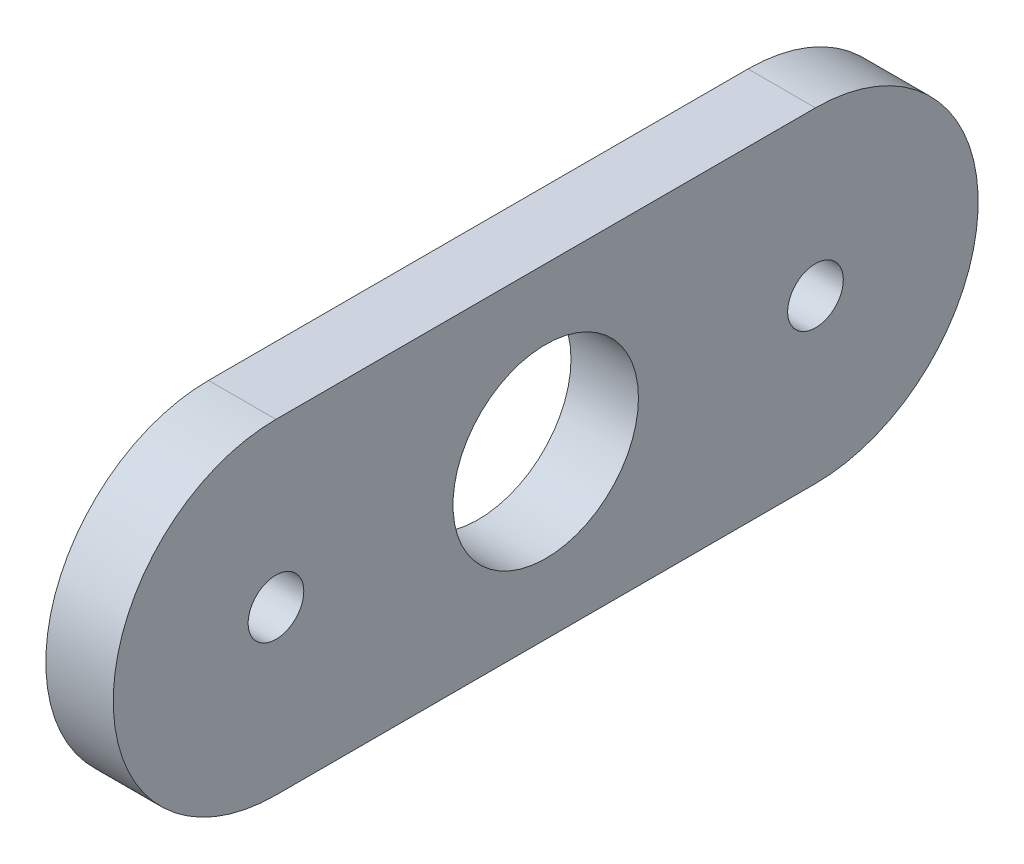
ISO-10303-21;
HEADER;
FILE_DESCRIPTION(('STEP AP214'),'2;1');
FILE_NAME('part.step','',(''),(''),'','','');
FILE_SCHEMA(('AUTOMOTIVE_DESIGN { 1 0 10303 214 1 1 1 1 }'));
ENDSEC;
DATA;
#1=APPLICATION_CONTEXT('core data for automotive mechanical design processes');
#2=APPLICATION_PROTOCOL_DEFINITION('international standard','automotive_design',2000,#1);
#3=PRODUCT_CONTEXT('',#1,'mechanical');
#4=PRODUCT('Part','Part','',(#3));
#5=PRODUCT_RELATED_PRODUCT_CATEGORY('part','',(#4));
#6=PRODUCT_DEFINITION_FORMATION('','',#4);
#7=PRODUCT_DEFINITION_CONTEXT('part definition',#1,'design');
#8=PRODUCT_DEFINITION('design','',#6,#7);
#9=PRODUCT_DEFINITION_SHAPE('','',#8);
#10=(LENGTH_UNIT() NAMED_UNIT(*) SI_UNIT(.MILLI.,.METRE.));
#11=(NAMED_UNIT(*) PLANE_ANGLE_UNIT() SI_UNIT($,.RADIAN.));
#12=(NAMED_UNIT(*) SI_UNIT($,.STERADIAN.) SOLID_ANGLE_UNIT());
#13=UNCERTAINTY_MEASURE_WITH_UNIT(LENGTH_MEASURE(1.E-05),#10,'distance_accuracy_value','');
#14=(GEOMETRIC_REPRESENTATION_CONTEXT(3) GLOBAL_UNCERTAINTY_ASSIGNED_CONTEXT((#13)) GLOBAL_UNIT_ASSIGNED_CONTEXT((#10,
#11,#12)) REPRESENTATION_CONTEXT('',''));
#15=CARTESIAN_POINT('',(0.,0.,0.));
#16=DIRECTION('',(0.,0.,1.));
#17=DIRECTION('',(1.,0.,0.));
#18=AXIS2_PLACEMENT_3D('',#15,#16,#17);
#19=CARTESIAN_POINT('',(4.,0.,16.));
#20=DIRECTION('',(1.,0.,0.));
#21=DIRECTION('',(0.,0.,-1.));
#22=AXIS2_PLACEMENT_3D('',#19,#20,#21);
#23=PLANE('',#22);
#24=CARTESIAN_POINT('',(4.,0.,-16.));
#25=DIRECTION('',(1.,0.,0.));
#26=DIRECTION('',(0.,0.,-1.));
#27=AXIS2_PLACEMENT_3D('',#24,#25,#26);
#28=CIRCLE('',#27,1.65);
#29=CARTESIAN_POINT('',(4.,0.,-17.65));
#30=VERTEX_POINT('',#29);
#31=EDGE_CURVE('E116',#30,#30,#28,.T.);
#32=ORIENTED_EDGE('',*,*,#31,.F.);
#33=EDGE_LOOP('',(#32));
#34=FACE_BOUND('',#33,.T.);
#35=CARTESIAN_POINT('',(4.,0.,16.));
#36=DIRECTION('',(1.,0.,0.));
#37=DIRECTION('',(0.,0.,-1.));
#38=AXIS2_PLACEMENT_3D('',#35,#36,#37);
#39=CIRCLE('',#38,9.65);
#40=CARTESIAN_POINT('',(4.,9.65,16.));
#41=VERTEX_POINT('',#40);
#42=CARTESIAN_POINT('',(4.,-9.65,16.));
#43=VERTEX_POINT('',#42);
#44=EDGE_CURVE('E86',#41,#43,#39,.T.);
#45=ORIENTED_EDGE('',*,*,#44,.T.);
#46=DIRECTION('',(0.,0.,-1.));
#47=VECTOR('',#46,1.);
#48=CARTESIAN_POINT('',(4.,-9.65,16.));
#49=LINE('',#48,#47);
#50=CARTESIAN_POINT('',(4.,-9.65,-16.));
#51=VERTEX_POINT('',#50);
#52=EDGE_CURVE('E81',#43,#51,#49,.T.);
#53=ORIENTED_EDGE('',*,*,#52,.T.);
#54=CARTESIAN_POINT('',(4.,0.,-16.));
#55=DIRECTION('',(1.,0.,0.));
#56=DIRECTION('',(0.,0.,-1.));
#57=AXIS2_PLACEMENT_3D('',#54,#55,#56);
#58=CIRCLE('',#57,9.65);
#59=CARTESIAN_POINT('',(4.,9.65000000000001,-16.));
#60=VERTEX_POINT('',#59);
#61=EDGE_CURVE('E84',#51,#60,#58,.T.);
#62=ORIENTED_EDGE('',*,*,#61,.T.);
#63=DIRECTION('',(0.,0.,1.));
#64=VECTOR('',#63,1.);
#65=CARTESIAN_POINT('',(4.,9.65,16.));
#66=LINE('',#65,#64);
#67=EDGE_CURVE('E51',#60,#41,#66,.T.);
#68=ORIENTED_EDGE('',*,*,#67,.T.);
#69=EDGE_LOOP('',(#45,#53,#62,#68));
#70=FACE_BOUND('',#69,.T.);
#71=CARTESIAN_POINT('',(4.,0.,16.));
#72=DIRECTION('',(1.,0.,0.));
#73=DIRECTION('',(0.,0.,-1.));
#74=AXIS2_PLACEMENT_3D('',#71,#72,#73);
#75=CIRCLE('',#74,1.65);
#76=CARTESIAN_POINT('',(4.,0.,14.35));
#77=VERTEX_POINT('',#76);
#78=EDGE_CURVE('E101',#77,#77,#75,.T.);
#79=ORIENTED_EDGE('',*,*,#78,.F.);
#80=EDGE_LOOP('',(#79));
#81=FACE_BOUND('',#80,.T.);
#82=CARTESIAN_POINT('',(4.,0.,0.));
#83=DIRECTION('',(1.,0.,0.));
#84=DIRECTION('',(0.,0.,-1.));
#85=AXIS2_PLACEMENT_3D('',#82,#83,#84);
#86=CIRCLE('',#85,5.5);
#87=CARTESIAN_POINT('',(4.,0.,-5.5));
#88=VERTEX_POINT('',#87);
#89=EDGE_CURVE('E122',#88,#88,#86,.T.);
#90=ORIENTED_EDGE('',*,*,#89,.F.);
#91=EDGE_LOOP('',(#90));
#92=FACE_BOUND('',#91,.T.);
#93=ADVANCED_FACE('F34',(#34,#70,#81,#92),#23,.T.);
#94=CARTESIAN_POINT('',(0.,0.,16.));
#95=DIRECTION('',(1.,0.,0.));
#96=DIRECTION('',(0.,0.,-1.));
#97=AXIS2_PLACEMENT_3D('',#94,#95,#96);
#98=PLANE('',#97);
#99=CARTESIAN_POINT('',(0.,0.,16.));
#100=DIRECTION('',(1.,0.,0.));
#101=DIRECTION('',(0.,0.,-1.));
#102=AXIS2_PLACEMENT_3D('',#99,#100,#101);
#103=CIRCLE('',#102,9.65);
#104=CARTESIAN_POINT('',(0.,9.65,16.));
#105=VERTEX_POINT('',#104);
#106=CARTESIAN_POINT('',(0.,-9.65,16.));
#107=VERTEX_POINT('',#106);
#108=EDGE_CURVE('E98',#105,#107,#103,.T.);
#109=ORIENTED_EDGE('',*,*,#108,.F.);
#110=DIRECTION('',(0.,0.,1.));
#111=VECTOR('',#110,1.);
#112=CARTESIAN_POINT('',(0.,9.65,16.));
#113=LINE('',#112,#111);
#114=CARTESIAN_POINT('',(0.,9.65000000000001,-16.));
#115=VERTEX_POINT('',#114);
#116=EDGE_CURVE('E74',#115,#105,#113,.T.);
#117=ORIENTED_EDGE('',*,*,#116,.F.);
#118=CARTESIAN_POINT('',(0.,0.,-16.));
#119=DIRECTION('',(1.,0.,0.));
#120=DIRECTION('',(0.,0.,-1.));
#121=AXIS2_PLACEMENT_3D('',#118,#119,#120);
#122=CIRCLE('',#121,9.65);
#123=CARTESIAN_POINT('',(0.,-9.65,-16.));
#124=VERTEX_POINT('',#123);
#125=EDGE_CURVE('E68',#124,#115,#122,.T.);
#126=ORIENTED_EDGE('',*,*,#125,.F.);
#127=DIRECTION('',(0.,0.,-1.));
#128=VECTOR('',#127,1.);
#129=CARTESIAN_POINT('',(0.,-9.65,16.));
#130=LINE('',#129,#128);
#131=EDGE_CURVE('E90',#107,#124,#130,.T.);
#132=ORIENTED_EDGE('',*,*,#131,.F.);
#133=EDGE_LOOP('',(#109,#117,#126,#132));
#134=FACE_BOUND('',#133,.T.);
#135=CARTESIAN_POINT('',(0.,0.,16.));
#136=DIRECTION('',(1.,0.,0.));
#137=DIRECTION('',(0.,0.,-1.));
#138=AXIS2_PLACEMENT_3D('',#135,#136,#137);
#139=CIRCLE('',#138,1.65);
#140=CARTESIAN_POINT('',(0.,0.,14.35));
#141=VERTEX_POINT('',#140);
#142=EDGE_CURVE('E113',#141,#141,#139,.T.);
#143=ORIENTED_EDGE('',*,*,#142,.T.);
#144=EDGE_LOOP('',(#143));
#145=FACE_BOUND('',#144,.T.);
#146=CARTESIAN_POINT('',(0.,0.,-16.));
#147=DIRECTION('',(1.,0.,0.));
#148=DIRECTION('',(0.,0.,-1.));
#149=AXIS2_PLACEMENT_3D('',#146,#147,#148);
#150=CIRCLE('',#149,1.65);
#151=CARTESIAN_POINT('',(0.,0.,-17.65));
#152=VERTEX_POINT('',#151);
#153=EDGE_CURVE('E119',#152,#152,#150,.T.);
#154=ORIENTED_EDGE('',*,*,#153,.T.);
#155=EDGE_LOOP('',(#154));
#156=FACE_BOUND('',#155,.T.);
#157=CARTESIAN_POINT('',(0.,0.,0.));
#158=DIRECTION('',(1.,0.,0.));
#159=DIRECTION('',(0.,0.,-1.));
#160=AXIS2_PLACEMENT_3D('',#157,#158,#159);
#161=CIRCLE('',#160,5.5);
#162=CARTESIAN_POINT('',(0.,0.,-5.5));
#163=VERTEX_POINT('',#162);
#164=EDGE_CURVE('E125',#163,#163,#161,.T.);
#165=ORIENTED_EDGE('',*,*,#164,.T.);
#166=EDGE_LOOP('',(#165));
#167=FACE_BOUND('',#166,.T.);
#168=ADVANCED_FACE('F109',(#134,#145,#156,#167),#98,.F.);
#169=CARTESIAN_POINT('',(4.,0.,16.));
#170=DIRECTION('',(-1.,0.,0.));
#171=DIRECTION('',(0.,0.,1.));
#172=AXIS2_PLACEMENT_3D('',#169,#170,#171);
#173=CYLINDRICAL_SURFACE('',#172,9.65);
#174=ORIENTED_EDGE('',*,*,#108,.T.);
#175=DIRECTION('',(-1.,0.,0.));
#176=VECTOR('',#175,1.);
#177=CARTESIAN_POINT('',(4.,-9.65,16.));
#178=LINE('',#177,#176);
#179=EDGE_CURVE('E11',#43,#107,#178,.T.);
#180=ORIENTED_EDGE('',*,*,#179,.F.);
#181=ORIENTED_EDGE('',*,*,#44,.F.);
#182=DIRECTION('',(-1.,0.,0.));
#183=VECTOR('',#182,1.);
#184=CARTESIAN_POINT('',(4.,9.65,16.));
#185=LINE('',#184,#183);
#186=EDGE_CURVE('E94',#41,#105,#185,.T.);
#187=ORIENTED_EDGE('',*,*,#186,.T.);
#188=EDGE_LOOP('',(#174,#180,#181,#187));
#189=FACE_BOUND('',#188,.T.);
#190=ADVANCED_FACE('F36',(#189),#173,.T.);
#191=CARTESIAN_POINT('',(4.,-9.65,16.));
#192=DIRECTION('',(0.,1.,0.));
#193=DIRECTION('',(0.,0.,1.));
#194=AXIS2_PLACEMENT_3D('',#191,#192,#193);
#195=PLANE('',#194);
#196=ORIENTED_EDGE('',*,*,#131,.T.);
#197=DIRECTION('',(-1.,0.,0.));
#198=VECTOR('',#197,1.);
#199=CARTESIAN_POINT('',(4.,-9.65,-16.));
#200=LINE('',#199,#198);
#201=EDGE_CURVE('E43',#51,#124,#200,.T.);
#202=ORIENTED_EDGE('',*,*,#201,.F.);
#203=ORIENTED_EDGE('',*,*,#52,.F.);
#204=ORIENTED_EDGE('',*,*,#179,.T.);
#205=EDGE_LOOP('',(#196,#202,#203,#204));
#206=FACE_BOUND('',#205,.T.);
#207=ADVANCED_FACE('F89',(#206),#195,.F.);
#208=CARTESIAN_POINT('',(4.,0.,-16.));
#209=DIRECTION('',(-1.,0.,0.));
#210=DIRECTION('',(0.,0.,1.));
#211=AXIS2_PLACEMENT_3D('',#208,#209,#210);
#212=CYLINDRICAL_SURFACE('',#211,9.65);
#213=ORIENTED_EDGE('',*,*,#125,.T.);
#214=DIRECTION('',(-1.,0.,0.));
#215=VECTOR('',#214,1.);
#216=CARTESIAN_POINT('',(4.,9.65000000000001,-16.));
#217=LINE('',#216,#215);
#218=EDGE_CURVE('E91',#60,#115,#217,.T.);
#219=ORIENTED_EDGE('',*,*,#218,.F.);
#220=ORIENTED_EDGE('',*,*,#61,.F.);
#221=ORIENTED_EDGE('',*,*,#201,.T.);
#222=EDGE_LOOP('',(#213,#219,#220,#221));
#223=FACE_BOUND('',#222,.T.);
#224=ADVANCED_FACE('F92',(#223),#212,.T.);
#225=CARTESIAN_POINT('',(4.,9.65,16.));
#226=DIRECTION('',(0.,-1.,0.));
#227=DIRECTION('',(0.,0.,-1.));
#228=AXIS2_PLACEMENT_3D('',#225,#226,#227);
#229=PLANE('',#228);
#230=ORIENTED_EDGE('',*,*,#116,.T.);
#231=ORIENTED_EDGE('',*,*,#186,.F.);
#232=ORIENTED_EDGE('',*,*,#67,.F.);
#233=ORIENTED_EDGE('',*,*,#218,.T.);
#234=EDGE_LOOP('',(#230,#231,#232,#233));
#235=FACE_BOUND('',#234,.T.);
#236=ADVANCED_FACE('F106',(#235),#229,.F.);
#237=CARTESIAN_POINT('',(4.,0.,16.));
#238=DIRECTION('',(-1.,0.,0.));
#239=DIRECTION('',(0.,0.,1.));
#240=AXIS2_PLACEMENT_3D('',#237,#238,#239);
#241=CYLINDRICAL_SURFACE('',#240,1.65);
#242=ORIENTED_EDGE('',*,*,#78,.T.);
#243=EDGE_LOOP('',(#242));
#244=FACE_BOUND('',#243,.T.);
#245=ORIENTED_EDGE('',*,*,#142,.F.);
#246=EDGE_LOOP('',(#245));
#247=FACE_BOUND('',#246,.T.);
#248=ADVANCED_FACE('F143',(#244,#247),#241,.F.);
#249=CARTESIAN_POINT('',(4.,0.,-16.));
#250=DIRECTION('',(-1.,0.,0.));
#251=DIRECTION('',(0.,0.,1.));
#252=AXIS2_PLACEMENT_3D('',#249,#250,#251);
#253=CYLINDRICAL_SURFACE('',#252,1.65);
#254=ORIENTED_EDGE('',*,*,#31,.T.);
#255=EDGE_LOOP('',(#254));
#256=FACE_BOUND('',#255,.T.);
#257=ORIENTED_EDGE('',*,*,#153,.F.);
#258=EDGE_LOOP('',(#257));
#259=FACE_BOUND('',#258,.T.);
#260=ADVANCED_FACE('F189',(#256,#259),#253,.F.);
#261=CARTESIAN_POINT('',(4.,0.,0.));
#262=DIRECTION('',(-1.,0.,0.));
#263=DIRECTION('',(0.,0.,1.));
#264=AXIS2_PLACEMENT_3D('',#261,#262,#263);
#265=CYLINDRICAL_SURFACE('',#264,5.5);
#266=ORIENTED_EDGE('',*,*,#89,.T.);
#267=EDGE_LOOP('',(#266));
#268=FACE_BOUND('',#267,.T.);
#269=ORIENTED_EDGE('',*,*,#164,.F.);
#270=EDGE_LOOP('',(#269));
#271=FACE_BOUND('',#270,.T.);
#272=ADVANCED_FACE('F131',(#268,#271),#265,.F.);
#273=CLOSED_SHELL('',(#93,#168,#190,#207,#224,#236,#248,#260,#272));
#274=MANIFOLD_SOLID_BREP('B2',#273);
#275=ADVANCED_BREP_SHAPE_REPRESENTATION('',(#18,#274),#14);
#276=SHAPE_DEFINITION_REPRESENTATION(#9,#275);
ENDSEC;
END-ISO-10303-21;
